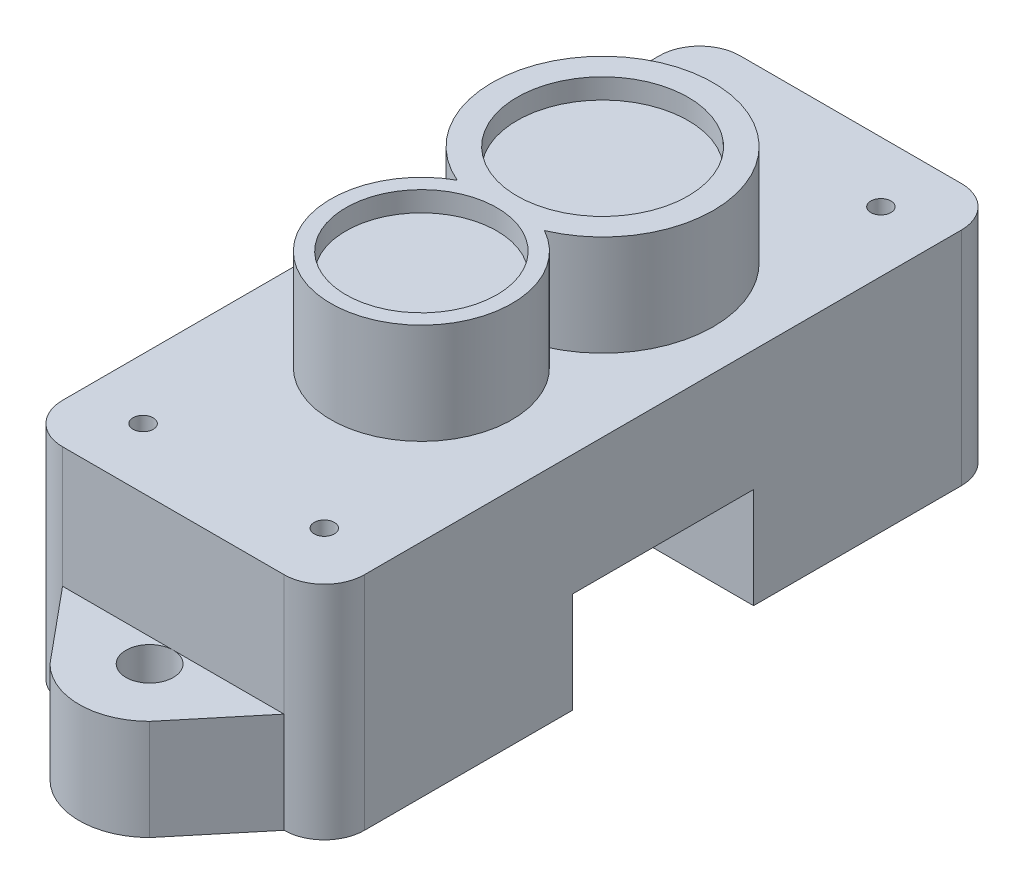
ISO-10303-21;
HEADER;
FILE_DESCRIPTION(('STEP AP214'),'2;1');
FILE_NAME('part.step','',(''),(''),'','','');
FILE_SCHEMA(('AUTOMOTIVE_DESIGN { 1 0 10303 214 1 1 1 1 }'));
ENDSEC;
DATA;
#1=APPLICATION_CONTEXT('core data for automotive mechanical design processes');
#2=APPLICATION_PROTOCOL_DEFINITION('international standard','automotive_design',2000,#1);
#3=PRODUCT_CONTEXT('',#1,'mechanical');
#4=PRODUCT('Part','Part','',(#3));
#5=PRODUCT_RELATED_PRODUCT_CATEGORY('part','',(#4));
#6=PRODUCT_DEFINITION_FORMATION('','',#4);
#7=PRODUCT_DEFINITION_CONTEXT('part definition',#1,'design');
#8=PRODUCT_DEFINITION('design','',#6,#7);
#9=PRODUCT_DEFINITION_SHAPE('','',#8);
#10=(LENGTH_UNIT() NAMED_UNIT(*) SI_UNIT(.MILLI.,.METRE.));
#11=(NAMED_UNIT(*) PLANE_ANGLE_UNIT() SI_UNIT($,.RADIAN.));
#12=(NAMED_UNIT(*) SI_UNIT($,.STERADIAN.) SOLID_ANGLE_UNIT());
#13=UNCERTAINTY_MEASURE_WITH_UNIT(LENGTH_MEASURE(1.E-05),#10,'distance_accuracy_value','');
#14=(GEOMETRIC_REPRESENTATION_CONTEXT(3) GLOBAL_UNCERTAINTY_ASSIGNED_CONTEXT((#13)) GLOBAL_UNIT_ASSIGNED_CONTEXT((#10,
#11,#12)) REPRESENTATION_CONTEXT('',''));
#15=CARTESIAN_POINT('',(0.,0.,0.));
#16=DIRECTION('',(0.,0.,1.));
#17=DIRECTION('',(1.,0.,0.));
#18=AXIS2_PLACEMENT_3D('',#15,#16,#17);
#19=CARTESIAN_POINT('',(7.5,0.,4.5));
#20=DIRECTION('',(0.,0.,1.));
#21=DIRECTION('',(0.,1.,0.));
#22=AXIS2_PLACEMENT_3D('',#19,#20,#21);
#23=PLANE('',#22);
#24=DIRECTION('',(0.,1.,0.));
#25=VECTOR('',#24,1.);
#26=CARTESIAN_POINT('',(7.5,0.,4.5));
#27=LINE('',#26,#25);
#28=CARTESIAN_POINT('',(7.5,0.,4.5));
#29=VERTEX_POINT('',#28);
#30=CARTESIAN_POINT('',(7.5,5.,4.5));
#31=VERTEX_POINT('',#30);
#32=EDGE_CURVE('E37',#29,#31,#27,.T.);
#33=ORIENTED_EDGE('',*,*,#32,.F.);
#34=DIRECTION('',(1.,0.,0.));
#35=VECTOR('',#34,1.);
#36=CARTESIAN_POINT('',(3.75,0.,4.5));
#37=LINE('',#36,#35);
#38=CARTESIAN_POINT('',(2.5,0.,4.5));
#39=VERTEX_POINT('',#38);
#40=EDGE_CURVE('E240',#39,#29,#37,.T.);
#41=ORIENTED_EDGE('',*,*,#40,.F.);
#42=DIRECTION('',(0.,1.,0.));
#43=VECTOR('',#42,1.);
#44=CARTESIAN_POINT('',(2.5,5.,4.5));
#45=LINE('',#44,#43);
#46=CARTESIAN_POINT('',(2.5,5.,4.5));
#47=VERTEX_POINT('',#46);
#48=EDGE_CURVE('E11',#39,#47,#45,.T.);
#49=ORIENTED_EDGE('',*,*,#48,.T.);
#50=DIRECTION('',(-1.,0.,0.));
#51=VECTOR('',#50,1.);
#52=CARTESIAN_POINT('',(7.5,5.,4.5));
#53=LINE('',#52,#51);
#54=EDGE_CURVE('E236',#31,#47,#53,.T.);
#55=ORIENTED_EDGE('',*,*,#54,.F.);
#56=EDGE_LOOP('',(#33,#41,#49,#55));
#57=FACE_BOUND('',#56,.T.);
#58=ADVANCED_FACE('F17',(#57),#23,.F.);
#59=CARTESIAN_POINT('',(7.5,5.,-4.5));
#60=DIRECTION('',(0.,0.,-1.));
#61=DIRECTION('',(0.,-1.,0.));
#62=AXIS2_PLACEMENT_3D('',#59,#60,#61);
#63=PLANE('',#62);
#64=DIRECTION('',(0.,-1.,0.));
#65=VECTOR('',#64,1.);
#66=CARTESIAN_POINT('',(7.5,2.5,-4.5));
#67=LINE('',#66,#65);
#68=CARTESIAN_POINT('',(7.5,5.,-4.5));
#69=VERTEX_POINT('',#68);
#70=CARTESIAN_POINT('',(7.5,0.,-4.5));
#71=VERTEX_POINT('',#70);
#72=EDGE_CURVE('E383',#69,#71,#67,.T.);
#73=ORIENTED_EDGE('',*,*,#72,.F.);
#74=DIRECTION('',(-1.,0.,0.));
#75=VECTOR('',#74,1.);
#76=CARTESIAN_POINT('',(7.5,5.,-4.5));
#77=LINE('',#76,#75);
#78=CARTESIAN_POINT('',(2.5,5.,-4.5));
#79=VERTEX_POINT('',#78);
#80=EDGE_CURVE('E28',#69,#79,#77,.T.);
#81=ORIENTED_EDGE('',*,*,#80,.T.);
#82=DIRECTION('',(0.,-1.,0.));
#83=VECTOR('',#82,1.);
#84=CARTESIAN_POINT('',(2.5,0.,-4.5));
#85=LINE('',#84,#83);
#86=CARTESIAN_POINT('',(2.5,0.,-4.5));
#87=VERTEX_POINT('',#86);
#88=EDGE_CURVE('E229',#79,#87,#85,.T.);
#89=ORIENTED_EDGE('',*,*,#88,.T.);
#90=DIRECTION('',(-1.,0.,0.));
#91=VECTOR('',#90,1.);
#92=CARTESIAN_POINT('',(3.75,0.,-4.5));
#93=LINE('',#92,#91);
#94=EDGE_CURVE('E215',#71,#87,#93,.T.);
#95=ORIENTED_EDGE('',*,*,#94,.F.);
#96=EDGE_LOOP('',(#73,#81,#89,#95));
#97=FACE_BOUND('',#96,.T.);
#98=ADVANCED_FACE('F230',(#97),#63,.F.);
#99=CARTESIAN_POINT('',(7.5,5.,4.5));
#100=DIRECTION('',(0.,1.,0.));
#101=DIRECTION('',(0.,0.,-1.));
#102=AXIS2_PLACEMENT_3D('',#99,#100,#101);
#103=PLANE('',#102);
#104=DIRECTION('',(0.,0.,-1.));
#105=VECTOR('',#104,1.);
#106=CARTESIAN_POINT('',(7.5,5.,9.6625));
#107=LINE('',#106,#105);
#108=EDGE_CURVE('E284',#31,#69,#107,.T.);
#109=ORIENTED_EDGE('',*,*,#108,.F.);
#110=ORIENTED_EDGE('',*,*,#54,.T.);
#111=DIRECTION('',(0.,0.,-1.));
#112=VECTOR('',#111,1.);
#113=CARTESIAN_POINT('',(2.5,5.,-4.5));
#114=LINE('',#113,#112);
#115=EDGE_CURVE('E226',#47,#79,#114,.T.);
#116=ORIENTED_EDGE('',*,*,#115,.T.);
#117=ORIENTED_EDGE('',*,*,#80,.F.);
#118=EDGE_LOOP('',(#109,#110,#116,#117));
#119=FACE_BOUND('',#118,.T.);
#120=ADVANCED_FACE('F19',(#119),#103,.F.);
#121=CARTESIAN_POINT('',(2.5,2.5,0.));
#122=DIRECTION('',(-1.,0.,0.));
#123=DIRECTION('',(0.,0.,1.));
#124=AXIS2_PLACEMENT_3D('',#121,#122,#123);
#125=PLANE('',#124);
#126=ORIENTED_EDGE('',*,*,#115,.F.);
#127=ORIENTED_EDGE('',*,*,#48,.F.);
#128=DIRECTION('',(0.,0.,1.));
#129=VECTOR('',#128,1.);
#130=CARTESIAN_POINT('',(2.5,0.,9.1266075687723));
#131=LINE('',#130,#129);
#132=EDGE_CURVE('E220',#87,#39,#131,.T.);
#133=ORIENTED_EDGE('',*,*,#132,.F.);
#134=ORIENTED_EDGE('',*,*,#88,.F.);
#135=EDGE_LOOP('',(#126,#127,#133,#134));
#136=FACE_BOUND('',#135,.T.);
#137=ADVANCED_FACE('F239',(#136),#125,.F.);
#138=CARTESIAN_POINT('',(0.,0.,18.2532151375446));
#139=DIRECTION('',(0.,1.,0.));
#140=DIRECTION('',(0.,0.,1.));
#141=AXIS2_PLACEMENT_3D('',#138,#139,#140);
#142=PLANE('',#141);
#143=ORIENTED_EDGE('',*,*,#94,.T.);
#144=ORIENTED_EDGE('',*,*,#132,.T.);
#145=ORIENTED_EDGE('',*,*,#40,.T.);
#146=DIRECTION('',(0.,0.,-1.));
#147=VECTOR('',#146,1.);
#148=CARTESIAN_POINT('',(7.5,0.,14.825));
#149=LINE('',#148,#147);
#150=CARTESIAN_POINT('',(7.5,0.,14.825));
#151=VERTEX_POINT('',#150);
#152=EDGE_CURVE('E312',#151,#29,#149,.T.);
#153=ORIENTED_EDGE('',*,*,#152,.F.);
#154=CARTESIAN_POINT('',(5.5,0.,14.825));
#155=DIRECTION('',(0.,1.,0.));
#156=DIRECTION('',(0.,0.,1.));
#157=AXIS2_PLACEMENT_3D('',#154,#155,#156);
#158=CIRCLE('',#157,2.);
#159=CARTESIAN_POINT('',(5.5,0.,16.825));
#160=VERTEX_POINT('',#159);
#161=EDGE_CURVE('E287',#160,#151,#158,.T.);
#162=ORIENTED_EDGE('',*,*,#161,.F.);
#163=DIRECTION('',(0.638136075973297,0.,-0.769923599158646));
#164=VECTOR('',#163,1.);
#165=CARTESIAN_POINT('',(2.47487373415292,0.,20.4748737341529));
#166=LINE('',#165,#164);
#167=CARTESIAN_POINT('',(2.47487373415292,0.,20.4748737341529));
#168=VERTEX_POINT('',#167);
#169=EDGE_CURVE('E126',#168,#160,#166,.T.);
#170=ORIENTED_EDGE('',*,*,#169,.F.);
#171=CARTESIAN_POINT('',(0.,0.,18.));
#172=DIRECTION('',(0.,1.,0.));
#173=DIRECTION('',(-0.826039840726179,0.,0.563611729414025));
#174=AXIS2_PLACEMENT_3D('',#171,#172,#173);
#175=CIRCLE('',#174,3.5);
#176=CARTESIAN_POINT('',(-2.47487373415292,0.,20.4748737341529));
#177=VERTEX_POINT('',#176);
#178=EDGE_CURVE('E136',#177,#168,#175,.T.);
#179=ORIENTED_EDGE('',*,*,#178,.F.);
#180=DIRECTION('',(0.638136075973296,0.,0.769923599158646));
#181=VECTOR('',#180,1.);
#182=CARTESIAN_POINT('',(-5.5,0.,16.825));
#183=LINE('',#182,#181);
#184=CARTESIAN_POINT('',(-5.5,0.,16.825));
#185=VERTEX_POINT('',#184);
#186=EDGE_CURVE('E255',#185,#177,#183,.T.);
#187=ORIENTED_EDGE('',*,*,#186,.F.);
#188=CARTESIAN_POINT('',(-5.5,0.,14.825));
#189=DIRECTION('',(0.,1.,0.));
#190=DIRECTION('',(-1.,0.,0.));
#191=AXIS2_PLACEMENT_3D('',#188,#189,#190);
#192=CIRCLE('',#191,2.);
#193=CARTESIAN_POINT('',(-7.5,0.,14.825));
#194=VERTEX_POINT('',#193);
#195=EDGE_CURVE('E288',#194,#185,#192,.T.);
#196=ORIENTED_EDGE('',*,*,#195,.F.);
#197=DIRECTION('',(0.,0.,1.));
#198=VECTOR('',#197,1.);
#199=CARTESIAN_POINT('',(-7.5,0.,-14.825));
#200=LINE('',#199,#198);
#201=CARTESIAN_POINT('',(-7.5,0.,-14.825));
#202=VERTEX_POINT('',#201);
#203=EDGE_CURVE('E376',#202,#194,#200,.T.);
#204=ORIENTED_EDGE('',*,*,#203,.F.);
#205=CARTESIAN_POINT('',(-5.5,0.,-14.825));
#206=DIRECTION('',(0.,1.,0.));
#207=DIRECTION('',(0.,0.,-1.));
#208=AXIS2_PLACEMENT_3D('',#205,#206,#207);
#209=CIRCLE('',#208,2.);
#210=CARTESIAN_POINT('',(-5.5,0.,-16.825));
#211=VERTEX_POINT('',#210);
#212=EDGE_CURVE('E272',#211,#202,#209,.T.);
#213=ORIENTED_EDGE('',*,*,#212,.F.);
#214=DIRECTION('',(-0.638136075973296,0.,0.769923599158646));
#215=VECTOR('',#214,1.);
#216=CARTESIAN_POINT('',(-2.47487373415292,0.,-20.4748737341529));
#217=LINE('',#216,#215);
#218=CARTESIAN_POINT('',(-2.47487373415292,0.,-20.4748737341529));
#219=VERTEX_POINT('',#218);
#220=EDGE_CURVE('E260',#219,#211,#217,.T.);
#221=ORIENTED_EDGE('',*,*,#220,.F.);
#222=CARTESIAN_POINT('',(0.,0.,-18.));
#223=DIRECTION('',(0.,1.,0.));
#224=DIRECTION('',(0.826039840726184,0.,-0.563611729414018));
#225=AXIS2_PLACEMENT_3D('',#222,#223,#224);
#226=CIRCLE('',#225,3.5);
#227=CARTESIAN_POINT('',(2.47487373415292,0.,-20.4748737341529));
#228=VERTEX_POINT('',#227);
#229=EDGE_CURVE('E261',#228,#219,#226,.T.);
#230=ORIENTED_EDGE('',*,*,#229,.F.);
#231=DIRECTION('',(-0.638136075973296,0.,-0.769923599158646));
#232=VECTOR('',#231,1.);
#233=CARTESIAN_POINT('',(5.5,0.,-16.825));
#234=LINE('',#233,#232);
#235=CARTESIAN_POINT('',(5.5,0.,-16.825));
#236=VERTEX_POINT('',#235);
#237=EDGE_CURVE('E283',#236,#228,#234,.T.);
#238=ORIENTED_EDGE('',*,*,#237,.F.);
#239=CARTESIAN_POINT('',(5.5,0.,-14.825));
#240=DIRECTION('',(0.,1.,0.));
#241=DIRECTION('',(1.,0.,0.));
#242=AXIS2_PLACEMENT_3D('',#239,#240,#241);
#243=CIRCLE('',#242,2.);
#244=CARTESIAN_POINT('',(7.5,0.,-14.825));
#245=VERTEX_POINT('',#244);
#246=EDGE_CURVE('E399',#245,#236,#243,.T.);
#247=ORIENTED_EDGE('',*,*,#246,.F.);
#248=DIRECTION('',(0.,0.,-1.));
#249=VECTOR('',#248,1.);
#250=CARTESIAN_POINT('',(7.5,0.,14.825));
#251=LINE('',#250,#249);
#252=EDGE_CURVE('E223',#71,#245,#251,.T.);
#253=ORIENTED_EDGE('',*,*,#252,.F.);
#254=EDGE_LOOP('',(#143,#144,#145,#153,#162,#170,#179,#187,#196,#204,#213,#221,#230,#238,#247,#253));
#255=FACE_BOUND('',#254,.T.);
#256=CARTESIAN_POINT('',(0.,0.,-18.));
#257=DIRECTION('',(0.,1.,0.));
#258=DIRECTION('',(1.,0.,0.));
#259=AXIS2_PLACEMENT_3D('',#256,#257,#258);
#260=CIRCLE('',#259,1.175);
#261=CARTESIAN_POINT('',(-1.175,0.,-18.));
#262=VERTEX_POINT('',#261);
#263=EDGE_CURVE('E242',#262,#262,#260,.T.);
#264=ORIENTED_EDGE('',*,*,#263,.T.);
#265=EDGE_LOOP('',(#264));
#266=FACE_BOUND('',#265,.T.);
#267=CARTESIAN_POINT('',(0.,0.,18.));
#268=DIRECTION('',(0.,1.,0.));
#269=DIRECTION('',(1.,0.,0.));
#270=AXIS2_PLACEMENT_3D('',#267,#268,#269);
#271=CIRCLE('',#270,1.175);
#272=CARTESIAN_POINT('',(-1.175,0.,18.));
#273=VERTEX_POINT('',#272);
#274=EDGE_CURVE('E265',#273,#273,#271,.T.);
#275=ORIENTED_EDGE('',*,*,#274,.T.);
#276=EDGE_LOOP('',(#275));
#277=FACE_BOUND('',#276,.T.);
#278=CARTESIAN_POINT('',(4.5,0.,-13.825));
#279=DIRECTION('',(0.,1.,0.));
#280=DIRECTION('',(-1.,0.,0.));
#281=AXIS2_PLACEMENT_3D('',#278,#279,#280);
#282=CIRCLE('',#281,0.5);
#283=CARTESIAN_POINT('',(5.,0.,-13.825));
#284=VERTEX_POINT('',#283);
#285=EDGE_CURVE('E262',#284,#284,#282,.T.);
#286=ORIENTED_EDGE('',*,*,#285,.T.);
#287=EDGE_LOOP('',(#286));
#288=FACE_BOUND('',#287,.T.);
#289=CARTESIAN_POINT('',(-4.5,0.,-13.825));
#290=DIRECTION('',(0.,1.,0.));
#291=DIRECTION('',(-1.,0.,0.));
#292=AXIS2_PLACEMENT_3D('',#289,#290,#291);
#293=CIRCLE('',#292,0.5);
#294=CARTESIAN_POINT('',(-4.,0.,-13.825));
#295=VERTEX_POINT('',#294);
#296=EDGE_CURVE('E266',#295,#295,#293,.T.);
#297=ORIENTED_EDGE('',*,*,#296,.T.);
#298=EDGE_LOOP('',(#297));
#299=FACE_BOUND('',#298,.T.);
#300=CARTESIAN_POINT('',(-4.5,0.,13.825));
#301=DIRECTION('',(0.,1.,0.));
#302=DIRECTION('',(-1.,0.,0.));
#303=AXIS2_PLACEMENT_3D('',#300,#301,#302);
#304=CIRCLE('',#303,0.5);
#305=CARTESIAN_POINT('',(-4.,0.,13.825));
#306=VERTEX_POINT('',#305);
#307=EDGE_CURVE('E329',#306,#306,#304,.T.);
#308=ORIENTED_EDGE('',*,*,#307,.T.);
#309=EDGE_LOOP('',(#308));
#310=FACE_BOUND('',#309,.T.);
#311=CARTESIAN_POINT('',(4.5,0.,13.825));
#312=DIRECTION('',(0.,1.,0.));
#313=DIRECTION('',(-1.,0.,0.));
#314=AXIS2_PLACEMENT_3D('',#311,#312,#313);
#315=CIRCLE('',#314,0.5);
#316=CARTESIAN_POINT('',(5.,0.,13.825));
#317=VERTEX_POINT('',#316);
#318=EDGE_CURVE('E332',#317,#317,#315,.T.);
#319=ORIENTED_EDGE('',*,*,#318,.T.);
#320=EDGE_LOOP('',(#319));
#321=FACE_BOUND('',#320,.T.);
#322=ADVANCED_FACE('F217',(#255,#266,#277,#288,#299,#310,#321),#142,.F.);
#323=CARTESIAN_POINT('',(4.5,11.,13.825));
#324=DIRECTION('',(0.,1.,0.));
#325=DIRECTION('',(-1.,0.,0.));
#326=AXIS2_PLACEMENT_3D('',#323,#324,#325);
#327=CYLINDRICAL_SURFACE('',#326,0.5);
#328=ORIENTED_EDGE('',*,*,#318,.F.);
#329=EDGE_LOOP('',(#328));
#330=FACE_BOUND('',#329,.T.);
#331=CARTESIAN_POINT('',(4.5,11.,13.825));
#332=DIRECTION('',(0.,-1.,0.));
#333=DIRECTION('',(-1.,0.,0.));
#334=AXIS2_PLACEMENT_3D('',#331,#332,#333);
#335=CIRCLE('',#334,0.5);
#336=CARTESIAN_POINT('',(5.,11.,13.825));
#337=VERTEX_POINT('',#336);
#338=EDGE_CURVE('E21',#337,#337,#335,.T.);
#339=ORIENTED_EDGE('',*,*,#338,.F.);
#340=EDGE_LOOP('',(#339));
#341=FACE_BOUND('',#340,.T.);
#342=ADVANCED_FACE('F569',(#330,#341),#327,.F.);
#343=CARTESIAN_POINT('',(-4.5,11.,13.825));
#344=DIRECTION('',(0.,1.,0.));
#345=DIRECTION('',(-1.,0.,0.));
#346=AXIS2_PLACEMENT_3D('',#343,#344,#345);
#347=CYLINDRICAL_SURFACE('',#346,0.5);
#348=ORIENTED_EDGE('',*,*,#307,.F.);
#349=EDGE_LOOP('',(#348));
#350=FACE_BOUND('',#349,.T.);
#351=CARTESIAN_POINT('',(-4.5,11.,13.825));
#352=DIRECTION('',(0.,-1.,0.));
#353=DIRECTION('',(-1.,0.,0.));
#354=AXIS2_PLACEMENT_3D('',#351,#352,#353);
#355=CIRCLE('',#354,0.5);
#356=CARTESIAN_POINT('',(-4.,11.,13.825));
#357=VERTEX_POINT('',#356);
#358=EDGE_CURVE('E342',#357,#357,#355,.T.);
#359=ORIENTED_EDGE('',*,*,#358,.F.);
#360=EDGE_LOOP('',(#359));
#361=FACE_BOUND('',#360,.T.);
#362=ADVANCED_FACE('F491',(#350,#361),#347,.F.);
#363=CARTESIAN_POINT('',(-4.5,11.,-13.825));
#364=DIRECTION('',(0.,1.,0.));
#365=DIRECTION('',(-1.,0.,0.));
#366=AXIS2_PLACEMENT_3D('',#363,#364,#365);
#367=CYLINDRICAL_SURFACE('',#366,0.5);
#368=ORIENTED_EDGE('',*,*,#296,.F.);
#369=EDGE_LOOP('',(#368));
#370=FACE_BOUND('',#369,.T.);
#371=CARTESIAN_POINT('',(-4.5,11.,-13.825));
#372=DIRECTION('',(0.,-1.,0.));
#373=DIRECTION('',(-1.,0.,0.));
#374=AXIS2_PLACEMENT_3D('',#371,#372,#373);
#375=CIRCLE('',#374,0.5);
#376=CARTESIAN_POINT('',(-4.,11.,-13.825));
#377=VERTEX_POINT('',#376);
#378=EDGE_CURVE('E345',#377,#377,#375,.T.);
#379=ORIENTED_EDGE('',*,*,#378,.F.);
#380=EDGE_LOOP('',(#379));
#381=FACE_BOUND('',#380,.T.);
#382=ADVANCED_FACE('F487',(#370,#381),#367,.F.);
#383=CARTESIAN_POINT('',(4.5,11.,-13.825));
#384=DIRECTION('',(0.,1.,0.));
#385=DIRECTION('',(-1.,0.,0.));
#386=AXIS2_PLACEMENT_3D('',#383,#384,#385);
#387=CYLINDRICAL_SURFACE('',#386,0.5);
#388=ORIENTED_EDGE('',*,*,#285,.F.);
#389=EDGE_LOOP('',(#388));
#390=FACE_BOUND('',#389,.T.);
#391=CARTESIAN_POINT('',(4.5,11.,-13.825));
#392=DIRECTION('',(0.,-1.,0.));
#393=DIRECTION('',(-1.,0.,0.));
#394=AXIS2_PLACEMENT_3D('',#391,#392,#393);
#395=CIRCLE('',#394,0.5);
#396=CARTESIAN_POINT('',(5.,11.,-13.825));
#397=VERTEX_POINT('',#396);
#398=EDGE_CURVE('E428',#397,#397,#395,.T.);
#399=ORIENTED_EDGE('',*,*,#398,.F.);
#400=EDGE_LOOP('',(#399));
#401=FACE_BOUND('',#400,.T.);
#402=ADVANCED_FACE('F490',(#390,#401),#387,.F.);
#403=CARTESIAN_POINT('',(0.,15.,4.5));
#404=DIRECTION('',(0.,1.,0.));
#405=DIRECTION('',(0.,0.,1.));
#406=AXIS2_PLACEMENT_3D('',#403,#404,#405);
#407=PLANE('',#406);
#408=CARTESIAN_POINT('',(0.,15.,4.5));
#409=DIRECTION('',(0.,-1.,0.));
#410=DIRECTION('',(-1.,0.,0.));
#411=AXIS2_PLACEMENT_3D('',#408,#409,#410);
#412=CIRCLE('',#411,3.75);
#413=CARTESIAN_POINT('',(3.75,15.,4.5));
#414=VERTEX_POINT('',#413);
#415=EDGE_CURVE('E299',#414,#414,#412,.T.);
#416=ORIENTED_EDGE('',*,*,#415,.F.);
#417=EDGE_LOOP('',(#416));
#418=FACE_BOUND('',#417,.T.);
#419=ADVANCED_FACE('F595',(#418),#407,.T.);
#420=CARTESIAN_POINT('',(0.,15.,-4.5));
#421=DIRECTION('',(0.,1.,0.));
#422=DIRECTION('',(0.,0.,1.));
#423=AXIS2_PLACEMENT_3D('',#420,#421,#422);
#424=PLANE('',#423);
#425=CARTESIAN_POINT('',(0.,15.,-4.5));
#426=DIRECTION('',(0.,-1.,0.));
#427=DIRECTION('',(-1.,0.,0.));
#428=AXIS2_PLACEMENT_3D('',#425,#426,#427);
#429=CIRCLE('',#428,4.25);
#430=CARTESIAN_POINT('',(4.25,15.,-4.5));
#431=VERTEX_POINT('',#430);
#432=EDGE_CURVE('E302',#431,#431,#429,.T.);
#433=ORIENTED_EDGE('',*,*,#432,.F.);
#434=EDGE_LOOP('',(#433));
#435=FACE_BOUND('',#434,.T.);
#436=ADVANCED_FACE('F600',(#435),#424,.T.);
#437=CARTESIAN_POINT('',(0.,11.,-4.5));
#438=DIRECTION('',(0.,-1.,0.));
#439=DIRECTION('',(-1.,0.,0.));
#440=AXIS2_PLACEMENT_3D('',#437,#438,#439);
#441=CYLINDRICAL_SURFACE('',#440,4.25);
#442=ORIENTED_EDGE('',*,*,#432,.T.);
#443=EDGE_LOOP('',(#442));
#444=FACE_BOUND('',#443,.T.);
#445=CARTESIAN_POINT('',(0.,16.,-4.5));
#446=DIRECTION('',(0.,-1.,0.));
#447=DIRECTION('',(-1.,0.,0.));
#448=AXIS2_PLACEMENT_3D('',#445,#446,#447);
#449=CIRCLE('',#448,4.25);
#450=CARTESIAN_POINT('',(4.25,16.,-4.5));
#451=VERTEX_POINT('',#450);
#452=EDGE_CURVE('E304',#451,#451,#449,.T.);
#453=ORIENTED_EDGE('',*,*,#452,.F.);
#454=EDGE_LOOP('',(#453));
#455=FACE_BOUND('',#454,.T.);
#456=ADVANCED_FACE('F648',(#444,#455),#441,.F.);
#457=CARTESIAN_POINT('',(0.,11.,4.5));
#458=DIRECTION('',(0.,-1.,0.));
#459=DIRECTION('',(-1.,0.,0.));
#460=AXIS2_PLACEMENT_3D('',#457,#458,#459);
#461=CYLINDRICAL_SURFACE('',#460,3.75);
#462=ORIENTED_EDGE('',*,*,#415,.T.);
#463=EDGE_LOOP('',(#462));
#464=FACE_BOUND('',#463,.T.);
#465=CARTESIAN_POINT('',(0.,16.,4.5));
#466=DIRECTION('',(0.,-1.,0.));
#467=DIRECTION('',(-1.,0.,0.));
#468=AXIS2_PLACEMENT_3D('',#465,#466,#467);
#469=CIRCLE('',#468,3.75);
#470=CARTESIAN_POINT('',(3.75,16.,4.5));
#471=VERTEX_POINT('',#470);
#472=EDGE_CURVE('E308',#471,#471,#469,.T.);
#473=ORIENTED_EDGE('',*,*,#472,.F.);
#474=EDGE_LOOP('',(#473));
#475=FACE_BOUND('',#474,.T.);
#476=ADVANCED_FACE('F576',(#464,#475),#461,.F.);
#477=CARTESIAN_POINT('',(0.,11.,4.5));
#478=DIRECTION('',(0.,-1.,0.));
#479=DIRECTION('',(0.48132317752143,0.,0.876543209876543));
#480=AXIS2_PLACEMENT_3D('',#477,#478,#479);
#481=CYLINDRICAL_SURFACE('',#480,4.5);
#482=CARTESIAN_POINT('',(0.,11.,4.5));
#483=DIRECTION('',(0.,-1.,0.));
#484=DIRECTION('',(0.48132317752143,0.,0.876543209876543));
#485=AXIS2_PLACEMENT_3D('',#482,#483,#484);
#486=CIRCLE('',#485,4.5);
#487=CARTESIAN_POINT('',(2.16595429884643,11.,0.555555555555556));
#488=VERTEX_POINT('',#487);
#489=CARTESIAN_POINT('',(-2.16595429884643,11.,0.555555555555556));
#490=VERTEX_POINT('',#489);
#491=EDGE_CURVE('E185',#488,#490,#486,.T.);
#492=ORIENTED_EDGE('',*,*,#491,.F.);
#493=DIRECTION('',(0.,1.,0.));
#494=VECTOR('',#493,1.);
#495=CARTESIAN_POINT('',(2.16595429884643,11.,0.555555555555556));
#496=LINE('',#495,#494);
#497=CARTESIAN_POINT('',(2.16595429884643,16.,0.555555555555556));
#498=VERTEX_POINT('',#497);
#499=EDGE_CURVE('E303',#488,#498,#496,.T.);
#500=ORIENTED_EDGE('',*,*,#499,.T.);
#501=CARTESIAN_POINT('',(0.,16.,4.5));
#502=DIRECTION('',(0.,1.,0.));
#503=DIRECTION('',(0.48132317752143,0.,0.876543209876543));
#504=AXIS2_PLACEMENT_3D('',#501,#502,#503);
#505=CIRCLE('',#504,4.5);
#506=CARTESIAN_POINT('',(-2.16595429884643,16.,0.555555555555556));
#507=VERTEX_POINT('',#506);
#508=EDGE_CURVE('E191',#507,#498,#505,.T.);
#509=ORIENTED_EDGE('',*,*,#508,.F.);
#510=DIRECTION('',(0.,1.,0.));
#511=VECTOR('',#510,1.);
#512=CARTESIAN_POINT('',(-2.16595429884643,11.,0.555555555555556));
#513=LINE('',#512,#511);
#514=EDGE_CURVE('E307',#490,#507,#513,.T.);
#515=ORIENTED_EDGE('',*,*,#514,.F.);
#516=EDGE_LOOP('',(#492,#500,#509,#515));
#517=FACE_BOUND('',#516,.T.);
#518=ADVANCED_FACE('F530',(#517),#481,.T.);
#519=CARTESIAN_POINT('',(0.,11.,-4.5));
#520=DIRECTION('',(0.,-1.,0.));
#521=DIRECTION('',(-0.393809872517534,0.,-0.919191919191919));
#522=AXIS2_PLACEMENT_3D('',#519,#520,#521);
#523=CYLINDRICAL_SURFACE('',#522,5.5);
#524=CARTESIAN_POINT('',(0.,11.,-4.5));
#525=DIRECTION('',(0.,-1.,0.));
#526=DIRECTION('',(-0.393809872517534,0.,-0.919191919191919));
#527=AXIS2_PLACEMENT_3D('',#524,#525,#526);
#528=CIRCLE('',#527,5.5);
#529=EDGE_CURVE('E327',#490,#488,#528,.T.);
#530=ORIENTED_EDGE('',*,*,#529,.F.);
#531=ORIENTED_EDGE('',*,*,#514,.T.);
#532=CARTESIAN_POINT('',(0.,16.,-4.5));
#533=DIRECTION('',(0.,1.,0.));
#534=DIRECTION('',(-0.393809872517534,0.,-0.919191919191919));
#535=AXIS2_PLACEMENT_3D('',#532,#533,#534);
#536=CIRCLE('',#535,5.5);
#537=EDGE_CURVE('E358',#498,#507,#536,.T.);
#538=ORIENTED_EDGE('',*,*,#537,.F.);
#539=ORIENTED_EDGE('',*,*,#499,.F.);
#540=EDGE_LOOP('',(#530,#531,#538,#539));
#541=FACE_BOUND('',#540,.T.);
#542=ADVANCED_FACE('F533',(#541),#523,.T.);
#543=CARTESIAN_POINT('',(0.,16.,-0.610985780479679));
#544=DIRECTION('',(0.,1.,0.));
#545=DIRECTION('',(0.,0.,1.));
#546=AXIS2_PLACEMENT_3D('',#543,#544,#545);
#547=PLANE('',#546);
#548=ORIENTED_EDGE('',*,*,#452,.T.);
#549=EDGE_LOOP('',(#548));
#550=FACE_BOUND('',#549,.T.);
#551=ORIENTED_EDGE('',*,*,#472,.T.);
#552=EDGE_LOOP('',(#551));
#553=FACE_BOUND('',#552,.T.);
#554=ORIENTED_EDGE('',*,*,#537,.T.);
#555=ORIENTED_EDGE('',*,*,#508,.T.);
#556=EDGE_LOOP('',(#554,#555));
#557=FACE_BOUND('',#556,.T.);
#558=ADVANCED_FACE('F498',(#550,#553,#557),#547,.T.);
#559=CARTESIAN_POINT('',(0.,11.,0.));
#560=DIRECTION('',(0.,1.,0.));
#561=DIRECTION('',(0.,0.,1.));
#562=AXIS2_PLACEMENT_3D('',#559,#560,#561);
#563=PLANE('',#562);
#564=ORIENTED_EDGE('',*,*,#338,.T.);
#565=EDGE_LOOP('',(#564));
#566=FACE_BOUND('',#565,.T.);
#567=ORIENTED_EDGE('',*,*,#358,.T.);
#568=EDGE_LOOP('',(#567));
#569=FACE_BOUND('',#568,.T.);
#570=ORIENTED_EDGE('',*,*,#378,.T.);
#571=EDGE_LOOP('',(#570));
#572=FACE_BOUND('',#571,.T.);
#573=ORIENTED_EDGE('',*,*,#398,.T.);
#574=EDGE_LOOP('',(#573));
#575=FACE_BOUND('',#574,.T.);
#576=ORIENTED_EDGE('',*,*,#491,.T.);
#577=ORIENTED_EDGE('',*,*,#529,.T.);
#578=EDGE_LOOP('',(#576,#577));
#579=FACE_BOUND('',#578,.T.);
#580=DIRECTION('',(0.,0.,1.));
#581=VECTOR('',#580,1.);
#582=CARTESIAN_POINT('',(-7.5,11.,-14.825));
#583=LINE('',#582,#581);
#584=CARTESIAN_POINT('',(-7.5,11.,-14.825));
#585=VERTEX_POINT('',#584);
#586=CARTESIAN_POINT('',(-7.5,11.,14.825));
#587=VERTEX_POINT('',#586);
#588=EDGE_CURVE('E323',#585,#587,#583,.T.);
#589=ORIENTED_EDGE('',*,*,#588,.T.);
#590=CARTESIAN_POINT('',(-5.5,11.,14.825));
#591=DIRECTION('',(0.,1.,0.));
#592=DIRECTION('',(-1.,0.,0.));
#593=AXIS2_PLACEMENT_3D('',#590,#591,#592);
#594=CIRCLE('',#593,2.);
#595=CARTESIAN_POINT('',(-5.5,11.,16.825));
#596=VERTEX_POINT('',#595);
#597=EDGE_CURVE('E328',#587,#596,#594,.T.);
#598=ORIENTED_EDGE('',*,*,#597,.T.);
#599=DIRECTION('',(1.,0.,0.));
#600=VECTOR('',#599,1.);
#601=CARTESIAN_POINT('',(-5.5,11.,16.825));
#602=LINE('',#601,#600);
#603=CARTESIAN_POINT('',(5.5,11.,16.825));
#604=VERTEX_POINT('',#603);
#605=EDGE_CURVE('E246',#596,#604,#602,.T.);
#606=ORIENTED_EDGE('',*,*,#605,.T.);
#607=CARTESIAN_POINT('',(5.5,11.,14.825));
#608=DIRECTION('',(0.,1.,0.));
#609=DIRECTION('',(0.,0.,1.));
#610=AXIS2_PLACEMENT_3D('',#607,#608,#609);
#611=CIRCLE('',#610,2.);
#612=CARTESIAN_POINT('',(7.5,11.,14.825));
#613=VERTEX_POINT('',#612);
#614=EDGE_CURVE('E424',#604,#613,#611,.T.);
#615=ORIENTED_EDGE('',*,*,#614,.T.);
#616=DIRECTION('',(0.,0.,-1.));
#617=VECTOR('',#616,1.);
#618=CARTESIAN_POINT('',(7.5,11.,14.825));
#619=LINE('',#618,#617);
#620=CARTESIAN_POINT('',(7.5,11.,-14.825));
#621=VERTEX_POINT('',#620);
#622=EDGE_CURVE('E337',#613,#621,#619,.T.);
#623=ORIENTED_EDGE('',*,*,#622,.T.);
#624=CARTESIAN_POINT('',(5.5,11.,-14.825));
#625=DIRECTION('',(0.,1.,0.));
#626=DIRECTION('',(1.,0.,0.));
#627=AXIS2_PLACEMENT_3D('',#624,#625,#626);
#628=CIRCLE('',#627,2.);
#629=CARTESIAN_POINT('',(5.5,11.,-16.825));
#630=VERTEX_POINT('',#629);
#631=EDGE_CURVE('E333',#621,#630,#628,.T.);
#632=ORIENTED_EDGE('',*,*,#631,.T.);
#633=DIRECTION('',(-1.,0.,0.));
#634=VECTOR('',#633,1.);
#635=CARTESIAN_POINT('',(5.5,11.,-16.825));
#636=LINE('',#635,#634);
#637=CARTESIAN_POINT('',(-5.5,11.,-16.825));
#638=VERTEX_POINT('',#637);
#639=EDGE_CURVE('E297',#630,#638,#636,.T.);
#640=ORIENTED_EDGE('',*,*,#639,.T.);
#641=CARTESIAN_POINT('',(-5.5,11.,-14.825));
#642=DIRECTION('',(0.,1.,0.));
#643=DIRECTION('',(0.,0.,-1.));
#644=AXIS2_PLACEMENT_3D('',#641,#642,#643);
#645=CIRCLE('',#644,2.);
#646=EDGE_CURVE('E294',#638,#585,#645,.T.);
#647=ORIENTED_EDGE('',*,*,#646,.T.);
#648=EDGE_LOOP('',(#589,#598,#606,#615,#623,#632,#640,#647));
#649=FACE_BOUND('',#648,.T.);
#650=ADVANCED_FACE('F494',(#566,#569,#572,#575,#579,#649),#563,.T.);
#651=CARTESIAN_POINT('',(5.5,5.,-16.825));
#652=DIRECTION('',(0.,0.,-1.));
#653=DIRECTION('',(-1.,0.,0.));
#654=AXIS2_PLACEMENT_3D('',#651,#652,#653);
#655=PLANE('',#654);
#656=DIRECTION('',(1.,0.,0.));
#657=VECTOR('',#656,1.);
#658=CARTESIAN_POINT('',(2.75,5.,-16.825));
#659=LINE('',#658,#657);
#660=CARTESIAN_POINT('',(0.,5.,-16.825));
#661=VERTEX_POINT('',#660);
#662=CARTESIAN_POINT('',(5.5,5.,-16.825));
#663=VERTEX_POINT('',#662);
#664=EDGE_CURVE('E405',#661,#663,#659,.T.);
#665=ORIENTED_EDGE('',*,*,#664,.F.);
#666=DIRECTION('',(1.,0.,0.));
#667=VECTOR('',#666,1.);
#668=CARTESIAN_POINT('',(2.75,5.,-16.825));
#669=LINE('',#668,#667);
#670=CARTESIAN_POINT('',(-5.5,5.,-16.825));
#671=VERTEX_POINT('',#670);
#672=EDGE_CURVE('E278',#671,#661,#669,.T.);
#673=ORIENTED_EDGE('',*,*,#672,.F.);
#674=DIRECTION('',(0.,1.,0.));
#675=VECTOR('',#674,1.);
#676=CARTESIAN_POINT('',(-5.5,5.,-16.825));
#677=LINE('',#676,#675);
#678=EDGE_CURVE('E298',#671,#638,#677,.T.);
#679=ORIENTED_EDGE('',*,*,#678,.T.);
#680=ORIENTED_EDGE('',*,*,#639,.F.);
#681=DIRECTION('',(0.,1.,0.));
#682=VECTOR('',#681,1.);
#683=CARTESIAN_POINT('',(5.5,5.,-16.825));
#684=LINE('',#683,#682);
#685=EDGE_CURVE('E267',#663,#630,#684,.T.);
#686=ORIENTED_EDGE('',*,*,#685,.F.);
#687=EDGE_LOOP('',(#665,#673,#679,#680,#686));
#688=FACE_BOUND('',#687,.T.);
#689=ADVANCED_FACE('F497',(#688),#655,.T.);
#690=CARTESIAN_POINT('',(-5.5,5.,16.825));
#691=DIRECTION('',(0.,0.,1.));
#692=DIRECTION('',(1.,0.,0.));
#693=AXIS2_PLACEMENT_3D('',#690,#691,#692);
#694=PLANE('',#693);
#695=DIRECTION('',(-1.,0.,0.));
#696=VECTOR('',#695,1.);
#697=CARTESIAN_POINT('',(-2.75,5.,16.825));
#698=LINE('',#697,#696);
#699=CARTESIAN_POINT('',(0.,5.,16.825));
#700=VERTEX_POINT('',#699);
#701=CARTESIAN_POINT('',(-5.5,5.,16.825));
#702=VERTEX_POINT('',#701);
#703=EDGE_CURVE('E394',#700,#702,#698,.T.);
#704=ORIENTED_EDGE('',*,*,#703,.F.);
#705=DIRECTION('',(-1.,0.,0.));
#706=VECTOR('',#705,1.);
#707=CARTESIAN_POINT('',(-2.75,5.,16.825));
#708=LINE('',#707,#706);
#709=CARTESIAN_POINT('',(5.5,5.,16.825));
#710=VERTEX_POINT('',#709);
#711=EDGE_CURVE('E338',#710,#700,#708,.T.);
#712=ORIENTED_EDGE('',*,*,#711,.F.);
#713=DIRECTION('',(0.,1.,0.));
#714=VECTOR('',#713,1.);
#715=CARTESIAN_POINT('',(5.5,5.,16.825));
#716=LINE('',#715,#714);
#717=EDGE_CURVE('E364',#710,#604,#716,.T.);
#718=ORIENTED_EDGE('',*,*,#717,.T.);
#719=ORIENTED_EDGE('',*,*,#605,.F.);
#720=DIRECTION('',(0.,1.,0.));
#721=VECTOR('',#720,1.);
#722=CARTESIAN_POINT('',(-5.5,5.,16.825));
#723=LINE('',#722,#721);
#724=EDGE_CURVE('E372',#702,#596,#723,.T.);
#725=ORIENTED_EDGE('',*,*,#724,.F.);
#726=EDGE_LOOP('',(#704,#712,#718,#719,#725));
#727=FACE_BOUND('',#726,.T.);
#728=ADVANCED_FACE('F513',(#727),#694,.T.);
#729=CARTESIAN_POINT('',(0.,5.,18.2532151375446));
#730=DIRECTION('',(0.,1.,0.));
#731=DIRECTION('',(0.,0.,1.));
#732=AXIS2_PLACEMENT_3D('',#729,#730,#731);
#733=PLANE('',#732);
#734=ORIENTED_EDGE('',*,*,#664,.T.);
#735=DIRECTION('',(-0.638136075973296,0.,-0.769923599158646));
#736=VECTOR('',#735,1.);
#737=CARTESIAN_POINT('',(5.5,5.,-16.825));
#738=LINE('',#737,#736);
#739=CARTESIAN_POINT('',(2.47487373415292,5.,-20.4748737341529));
#740=VERTEX_POINT('',#739);
#741=EDGE_CURVE('E368',#663,#740,#738,.T.);
#742=ORIENTED_EDGE('',*,*,#741,.T.);
#743=CARTESIAN_POINT('',(0.,5.,-18.));
#744=DIRECTION('',(0.,1.,0.));
#745=DIRECTION('',(0.826039840726184,0.,-0.563611729414018));
#746=AXIS2_PLACEMENT_3D('',#743,#744,#745);
#747=CIRCLE('',#746,3.5);
#748=CARTESIAN_POINT('',(-2.47487373415292,5.,-20.4748737341529));
#749=VERTEX_POINT('',#748);
#750=EDGE_CURVE('E277',#740,#749,#747,.T.);
#751=ORIENTED_EDGE('',*,*,#750,.T.);
#752=DIRECTION('',(-0.638136075973296,0.,0.769923599158646));
#753=VECTOR('',#752,1.);
#754=CARTESIAN_POINT('',(-2.47487373415292,5.,-20.4748737341529));
#755=LINE('',#754,#753);
#756=EDGE_CURVE('E273',#749,#671,#755,.T.);
#757=ORIENTED_EDGE('',*,*,#756,.T.);
#758=ORIENTED_EDGE('',*,*,#672,.T.);
#759=CARTESIAN_POINT('',(0.,5.,-18.));
#760=DIRECTION('',(0.,-1.,0.));
#761=DIRECTION('',(1.,0.,0.));
#762=AXIS2_PLACEMENT_3D('',#759,#760,#761);
#763=CIRCLE('',#762,1.175);
#764=EDGE_CURVE('E311',#661,#661,#763,.T.);
#765=ORIENTED_EDGE('',*,*,#764,.T.);
#766=EDGE_LOOP('',(#734,#742,#751,#757,#758,#765));
#767=FACE_BOUND('',#766,.T.);
#768=ADVANCED_FACE('F579',(#767),#733,.T.);
#769=CARTESIAN_POINT('',(0.,5.,18.2532151375446));
#770=DIRECTION('',(0.,1.,0.));
#771=DIRECTION('',(0.,0.,1.));
#772=AXIS2_PLACEMENT_3D('',#769,#770,#771);
#773=PLANE('',#772);
#774=ORIENTED_EDGE('',*,*,#711,.T.);
#775=CARTESIAN_POINT('',(0.,5.,18.));
#776=DIRECTION('',(0.,-1.,0.));
#777=DIRECTION('',(1.,0.,0.));
#778=AXIS2_PLACEMENT_3D('',#775,#776,#777);
#779=CIRCLE('',#778,1.175);
#780=EDGE_CURVE('E341',#700,#700,#779,.T.);
#781=ORIENTED_EDGE('',*,*,#780,.T.);
#782=ORIENTED_EDGE('',*,*,#703,.T.);
#783=DIRECTION('',(0.638136075973296,0.,0.769923599158646));
#784=VECTOR('',#783,1.);
#785=CARTESIAN_POINT('',(-5.5,5.,16.825));
#786=LINE('',#785,#784);
#787=CARTESIAN_POINT('',(-2.47487373415292,5.,20.4748737341529));
#788=VERTEX_POINT('',#787);
#789=EDGE_CURVE('E390',#702,#788,#786,.T.);
#790=ORIENTED_EDGE('',*,*,#789,.T.);
#791=CARTESIAN_POINT('',(0.,5.,18.));
#792=DIRECTION('',(0.,1.,0.));
#793=DIRECTION('',(-0.826039840726179,0.,0.563611729414025));
#794=AXIS2_PLACEMENT_3D('',#791,#792,#793);
#795=CIRCLE('',#794,3.5);
#796=CARTESIAN_POINT('',(2.47487373415292,5.,20.4748737341529));
#797=VERTEX_POINT('',#796);
#798=EDGE_CURVE('E395',#788,#797,#795,.T.);
#799=ORIENTED_EDGE('',*,*,#798,.T.);
#800=DIRECTION('',(0.638136075973297,0.,-0.769923599158646));
#801=VECTOR('',#800,1.);
#802=CARTESIAN_POINT('',(2.47487373415292,5.,20.4748737341529));
#803=LINE('',#802,#801);
#804=EDGE_CURVE('E403',#797,#710,#803,.T.);
#805=ORIENTED_EDGE('',*,*,#804,.T.);
#806=EDGE_LOOP('',(#774,#781,#782,#790,#799,#805));
#807=FACE_BOUND('',#806,.T.);
#808=ADVANCED_FACE('F520',(#807),#773,.T.);
#809=CARTESIAN_POINT('',(0.,0.,18.));
#810=DIRECTION('',(0.,-1.,0.));
#811=DIRECTION('',(1.,0.,0.));
#812=AXIS2_PLACEMENT_3D('',#809,#810,#811);
#813=CYLINDRICAL_SURFACE('',#812,1.175);
#814=ORIENTED_EDGE('',*,*,#780,.F.);
#815=EDGE_LOOP('',(#814));
#816=FACE_BOUND('',#815,.T.);
#817=ORIENTED_EDGE('',*,*,#274,.F.);
#818=EDGE_LOOP('',(#817));
#819=FACE_BOUND('',#818,.T.);
#820=ADVANCED_FACE('F581',(#816,#819),#813,.F.);
#821=CARTESIAN_POINT('',(0.,0.,-18.));
#822=DIRECTION('',(0.,-1.,0.));
#823=DIRECTION('',(1.,0.,0.));
#824=AXIS2_PLACEMENT_3D('',#821,#822,#823);
#825=CYLINDRICAL_SURFACE('',#824,1.175);
#826=ORIENTED_EDGE('',*,*,#764,.F.);
#827=EDGE_LOOP('',(#826));
#828=FACE_BOUND('',#827,.T.);
#829=ORIENTED_EDGE('',*,*,#263,.F.);
#830=EDGE_LOOP('',(#829));
#831=FACE_BOUND('',#830,.T.);
#832=ADVANCED_FACE('F554',(#828,#831),#825,.F.);
#833=CARTESIAN_POINT('',(5.5,0.,-14.825));
#834=DIRECTION('',(0.,-1.,0.));
#835=DIRECTION('',(1.,0.,0.));
#836=AXIS2_PLACEMENT_3D('',#833,#834,#835);
#837=CYLINDRICAL_SURFACE('',#836,2.);
#838=ORIENTED_EDGE('',*,*,#246,.T.);
#839=DIRECTION('',(0.,1.,0.));
#840=VECTOR('',#839,1.);
#841=CARTESIAN_POINT('',(5.5,0.,-16.825));
#842=LINE('',#841,#840);
#843=EDGE_CURVE('E271',#236,#663,#842,.T.);
#844=ORIENTED_EDGE('',*,*,#843,.T.);
#845=ORIENTED_EDGE('',*,*,#685,.T.);
#846=ORIENTED_EDGE('',*,*,#631,.F.);
#847=DIRECTION('',(0.,1.,0.));
#848=VECTOR('',#847,1.);
#849=CARTESIAN_POINT('',(7.5,0.,-14.825));
#850=LINE('',#849,#848);
#851=EDGE_CURVE('E316',#245,#621,#850,.T.);
#852=ORIENTED_EDGE('',*,*,#851,.F.);
#853=EDGE_LOOP('',(#838,#844,#845,#846,#852));
#854=FACE_BOUND('',#853,.T.);
#855=ADVANCED_FACE('F589',(#854),#837,.T.);
#856=CARTESIAN_POINT('',(-5.5,0.,-14.825));
#857=DIRECTION('',(0.,-1.,0.));
#858=DIRECTION('',(0.,0.,-1.));
#859=AXIS2_PLACEMENT_3D('',#856,#857,#858);
#860=CYLINDRICAL_SURFACE('',#859,2.);
#861=ORIENTED_EDGE('',*,*,#212,.T.);
#862=DIRECTION('',(0.,1.,0.));
#863=VECTOR('',#862,1.);
#864=CARTESIAN_POINT('',(-7.5,0.,-14.825));
#865=LINE('',#864,#863);
#866=EDGE_CURVE('E322',#202,#585,#865,.T.);
#867=ORIENTED_EDGE('',*,*,#866,.T.);
#868=ORIENTED_EDGE('',*,*,#646,.F.);
#869=ORIENTED_EDGE('',*,*,#678,.F.);
#870=DIRECTION('',(0.,1.,0.));
#871=VECTOR('',#870,1.);
#872=CARTESIAN_POINT('',(-5.5,0.,-16.825));
#873=LINE('',#872,#871);
#874=EDGE_CURVE('E256',#211,#671,#873,.T.);
#875=ORIENTED_EDGE('',*,*,#874,.F.);
#876=EDGE_LOOP('',(#861,#867,#868,#869,#875));
#877=FACE_BOUND('',#876,.T.);
#878=ADVANCED_FACE('F572',(#877),#860,.T.);
#879=CARTESIAN_POINT('',(-2.47487373415292,0.,-20.4748737341529));
#880=DIRECTION('',(-0.769923599158646,0.,-0.638136075973296));
#881=DIRECTION('',(-0.638136075973296,0.,0.769923599158646));
#882=AXIS2_PLACEMENT_3D('',#879,#880,#881);
#883=PLANE('',#882);
#884=ORIENTED_EDGE('',*,*,#220,.T.);
#885=ORIENTED_EDGE('',*,*,#874,.T.);
#886=ORIENTED_EDGE('',*,*,#756,.F.);
#887=DIRECTION('',(0.,1.,0.));
#888=VECTOR('',#887,1.);
#889=CARTESIAN_POINT('',(-2.47487373415292,0.,-20.4748737341529));
#890=LINE('',#889,#888);
#891=EDGE_CURVE('E279',#219,#749,#890,.T.);
#892=ORIENTED_EDGE('',*,*,#891,.F.);
#893=EDGE_LOOP('',(#884,#885,#886,#892));
#894=FACE_BOUND('',#893,.T.);
#895=ADVANCED_FACE('F560',(#894),#883,.T.);
#896=CARTESIAN_POINT('',(0.,0.,-18.));
#897=DIRECTION('',(0.,-1.,0.));
#898=DIRECTION('',(0.826039840726184,0.,-0.563611729414018));
#899=AXIS2_PLACEMENT_3D('',#896,#897,#898);
#900=CYLINDRICAL_SURFACE('',#899,3.5);
#901=ORIENTED_EDGE('',*,*,#229,.T.);
#902=ORIENTED_EDGE('',*,*,#891,.T.);
#903=ORIENTED_EDGE('',*,*,#750,.F.);
#904=DIRECTION('',(0.,1.,0.));
#905=VECTOR('',#904,1.);
#906=CARTESIAN_POINT('',(2.47487373415292,0.,-20.4748737341529));
#907=LINE('',#906,#905);
#908=EDGE_CURVE('E292',#228,#740,#907,.T.);
#909=ORIENTED_EDGE('',*,*,#908,.F.);
#910=EDGE_LOOP('',(#901,#902,#903,#909));
#911=FACE_BOUND('',#910,.T.);
#912=ADVANCED_FACE('F556',(#911),#900,.T.);
#913=CARTESIAN_POINT('',(5.5,0.,-16.825));
#914=DIRECTION('',(0.769923599158646,0.,-0.638136075973296));
#915=DIRECTION('',(-0.638136075973296,0.,-0.769923599158646));
#916=AXIS2_PLACEMENT_3D('',#913,#914,#915);
#917=PLANE('',#916);
#918=ORIENTED_EDGE('',*,*,#237,.T.);
#919=ORIENTED_EDGE('',*,*,#908,.T.);
#920=ORIENTED_EDGE('',*,*,#741,.F.);
#921=ORIENTED_EDGE('',*,*,#843,.F.);
#922=EDGE_LOOP('',(#918,#919,#920,#921));
#923=FACE_BOUND('',#922,.T.);
#924=ADVANCED_FACE('F559',(#923),#917,.T.);
#925=CARTESIAN_POINT('',(-5.5,0.,14.825));
#926=DIRECTION('',(0.,-1.,0.));
#927=DIRECTION('',(-1.,0.,0.));
#928=AXIS2_PLACEMENT_3D('',#925,#926,#927);
#929=CYLINDRICAL_SURFACE('',#928,2.);
#930=ORIENTED_EDGE('',*,*,#195,.T.);
#931=DIRECTION('',(0.,1.,0.));
#932=VECTOR('',#931,1.);
#933=CARTESIAN_POINT('',(-5.5,0.,16.825));
#934=LINE('',#933,#932);
#935=EDGE_CURVE('E293',#185,#702,#934,.T.);
#936=ORIENTED_EDGE('',*,*,#935,.T.);
#937=ORIENTED_EDGE('',*,*,#724,.T.);
#938=ORIENTED_EDGE('',*,*,#597,.F.);
#939=DIRECTION('',(0.,1.,0.));
#940=VECTOR('',#939,1.);
#941=CARTESIAN_POINT('',(-7.5,0.,14.825));
#942=LINE('',#941,#940);
#943=EDGE_CURVE('E382',#194,#587,#942,.T.);
#944=ORIENTED_EDGE('',*,*,#943,.F.);
#945=EDGE_LOOP('',(#930,#936,#937,#938,#944));
#946=FACE_BOUND('',#945,.T.);
#947=ADVANCED_FACE('F509',(#946),#929,.T.);
#948=CARTESIAN_POINT('',(-7.5,0.,0.));
#949=DIRECTION('',(-1.,0.,0.));
#950=DIRECTION('',(0.,0.,1.));
#951=AXIS2_PLACEMENT_3D('',#948,#949,#950);
#952=PLANE('',#951);
#953=ORIENTED_EDGE('',*,*,#203,.T.);
#954=ORIENTED_EDGE('',*,*,#943,.T.);
#955=ORIENTED_EDGE('',*,*,#588,.F.);
#956=ORIENTED_EDGE('',*,*,#866,.F.);
#957=EDGE_LOOP('',(#953,#954,#955,#956));
#958=FACE_BOUND('',#957,.T.);
#959=ADVANCED_FACE('F506',(#958),#952,.T.);
#960=CARTESIAN_POINT('',(7.5,0.,14.825));
#961=DIRECTION('',(1.,0.,0.));
#962=DIRECTION('',(0.,0.,-1.));
#963=AXIS2_PLACEMENT_3D('',#960,#961,#962);
#964=PLANE('',#963);
#965=ORIENTED_EDGE('',*,*,#72,.T.);
#966=ORIENTED_EDGE('',*,*,#252,.T.);
#967=ORIENTED_EDGE('',*,*,#851,.T.);
#968=ORIENTED_EDGE('',*,*,#622,.F.);
#969=DIRECTION('',(0.,1.,0.));
#970=VECTOR('',#969,1.);
#971=CARTESIAN_POINT('',(7.5,0.,14.825));
#972=LINE('',#971,#970);
#973=EDGE_CURVE('E396',#151,#613,#972,.T.);
#974=ORIENTED_EDGE('',*,*,#973,.F.);
#975=ORIENTED_EDGE('',*,*,#152,.T.);
#976=ORIENTED_EDGE('',*,*,#32,.T.);
#977=ORIENTED_EDGE('',*,*,#108,.T.);
#978=EDGE_LOOP('',(#965,#966,#967,#968,#974,#975,#976,#977));
#979=FACE_BOUND('',#978,.T.);
#980=ADVANCED_FACE('F606',(#979),#964,.T.);
#981=CARTESIAN_POINT('',(5.5,0.,14.825));
#982=DIRECTION('',(0.,-1.,0.));
#983=DIRECTION('',(0.,0.,1.));
#984=AXIS2_PLACEMENT_3D('',#981,#982,#983);
#985=CYLINDRICAL_SURFACE('',#984,2.);
#986=ORIENTED_EDGE('',*,*,#161,.T.);
#987=ORIENTED_EDGE('',*,*,#973,.T.);
#988=ORIENTED_EDGE('',*,*,#614,.F.);
#989=ORIENTED_EDGE('',*,*,#717,.F.);
#990=DIRECTION('',(0.,1.,0.));
#991=VECTOR('',#990,1.);
#992=CARTESIAN_POINT('',(5.5,0.,16.825));
#993=LINE('',#992,#991);
#994=EDGE_CURVE('E248',#160,#710,#993,.T.);
#995=ORIENTED_EDGE('',*,*,#994,.F.);
#996=EDGE_LOOP('',(#986,#987,#988,#989,#995));
#997=FACE_BOUND('',#996,.T.);
#998=ADVANCED_FACE('F566',(#997),#985,.T.);
#999=CARTESIAN_POINT('',(2.47487373415292,0.,20.4748737341529));
#1000=DIRECTION('',(0.769923599158646,0.,0.638136075973297));
#1001=DIRECTION('',(0.638136075973297,0.,-0.769923599158646));
#1002=AXIS2_PLACEMENT_3D('',#999,#1000,#1001);
#1003=PLANE('',#1002);
#1004=ORIENTED_EDGE('',*,*,#169,.T.);
#1005=ORIENTED_EDGE('',*,*,#994,.T.);
#1006=ORIENTED_EDGE('',*,*,#804,.F.);
#1007=DIRECTION('',(0.,1.,0.));
#1008=VECTOR('',#1007,1.);
#1009=CARTESIAN_POINT('',(2.47487373415292,0.,20.4748737341529));
#1010=LINE('',#1009,#1008);
#1011=EDGE_CURVE('E379',#168,#797,#1010,.T.);
#1012=ORIENTED_EDGE('',*,*,#1011,.F.);
#1013=EDGE_LOOP('',(#1004,#1005,#1006,#1012));
#1014=FACE_BOUND('',#1013,.T.);
#1015=ADVANCED_FACE('F562',(#1014),#1003,.T.);
#1016=CARTESIAN_POINT('',(0.,0.,18.));
#1017=DIRECTION('',(0.,-1.,0.));
#1018=DIRECTION('',(-0.826039840726179,0.,0.563611729414026));
#1019=AXIS2_PLACEMENT_3D('',#1016,#1017,#1018);
#1020=CYLINDRICAL_SURFACE('',#1019,3.5);
#1021=ORIENTED_EDGE('',*,*,#178,.T.);
#1022=ORIENTED_EDGE('',*,*,#1011,.T.);
#1023=ORIENTED_EDGE('',*,*,#798,.F.);
#1024=DIRECTION('',(0.,1.,0.));
#1025=VECTOR('',#1024,1.);
#1026=CARTESIAN_POINT('',(-2.47487373415292,0.,20.4748737341529));
#1027=LINE('',#1026,#1025);
#1028=EDGE_CURVE('E251',#177,#788,#1027,.T.);
#1029=ORIENTED_EDGE('',*,*,#1028,.F.);
#1030=EDGE_LOOP('',(#1021,#1022,#1023,#1029));
#1031=FACE_BOUND('',#1030,.T.);
#1032=ADVANCED_FACE('F565',(#1031),#1020,.T.);
#1033=CARTESIAN_POINT('',(-5.5,0.,16.825));
#1034=DIRECTION('',(-0.769923599158646,0.,0.638136075973296));
#1035=DIRECTION('',(0.638136075973296,0.,0.769923599158646));
#1036=AXIS2_PLACEMENT_3D('',#1033,#1034,#1035);
#1037=PLANE('',#1036);
#1038=ORIENTED_EDGE('',*,*,#186,.T.);
#1039=ORIENTED_EDGE('',*,*,#1028,.T.);
#1040=ORIENTED_EDGE('',*,*,#789,.F.);
#1041=ORIENTED_EDGE('',*,*,#935,.F.);
#1042=EDGE_LOOP('',(#1038,#1039,#1040,#1041));
#1043=FACE_BOUND('',#1042,.T.);
#1044=ADVANCED_FACE('F518',(#1043),#1037,.T.);
#1045=CLOSED_SHELL('',(#58,#98,#120,#137,#322,#342,#362,#382,#402,#419,#436,#456,#476,#518,#542,
#558,#650,#689,#728,#768,#808,#820,#832,#855,#878,#895,#912,#924,#947,#959,#980,#998,#1015,
#1032,#1044));
#1046=MANIFOLD_SOLID_BREP('B1',#1045);
#1047=ADVANCED_BREP_SHAPE_REPRESENTATION('',(#18,#1046),#14);
#1048=SHAPE_DEFINITION_REPRESENTATION(#9,#1047);
ENDSEC;
END-ISO-10303-21;
